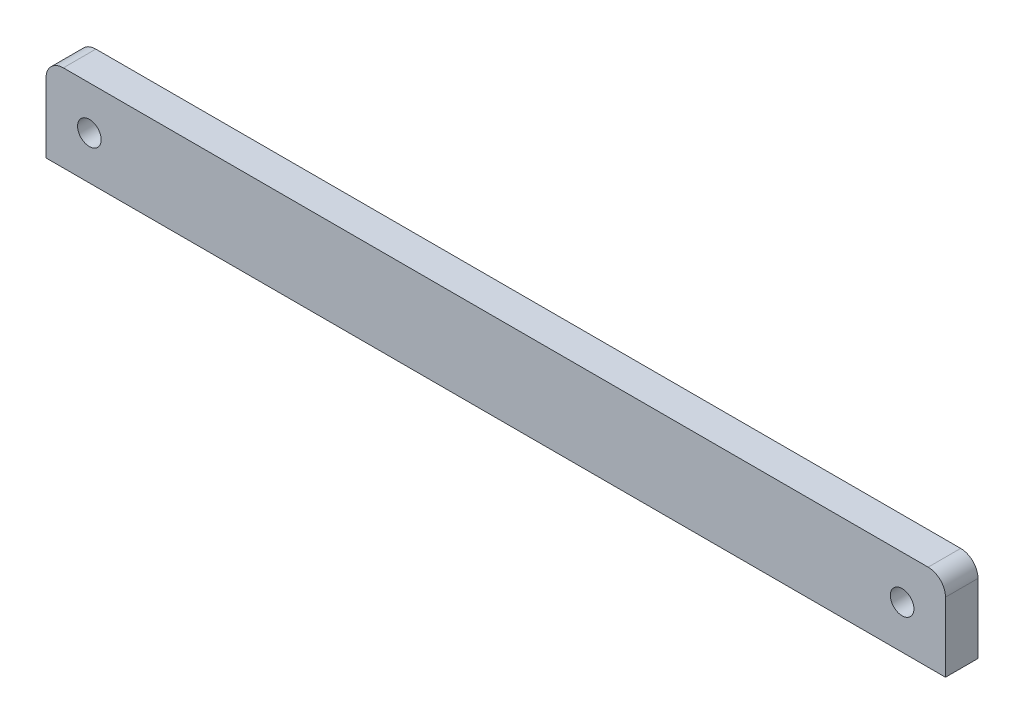
ISO-10303-21;
HEADER;
FILE_DESCRIPTION(('STEP AP214'),'2;1');
FILE_NAME('part.step','',(''),(''),'','','');
FILE_SCHEMA(('AUTOMOTIVE_DESIGN { 1 0 10303 214 1 1 1 1 }'));
ENDSEC;
DATA;
#1=APPLICATION_CONTEXT('core data for automotive mechanical design processes');
#2=APPLICATION_PROTOCOL_DEFINITION('international standard','automotive_design',2000,#1);
#3=PRODUCT_CONTEXT('',#1,'mechanical');
#4=PRODUCT('Part','Part','',(#3));
#5=PRODUCT_RELATED_PRODUCT_CATEGORY('part','',(#4));
#6=PRODUCT_DEFINITION_FORMATION('','',#4);
#7=PRODUCT_DEFINITION_CONTEXT('part definition',#1,'design');
#8=PRODUCT_DEFINITION('design','',#6,#7);
#9=PRODUCT_DEFINITION_SHAPE('','',#8);
#10=(LENGTH_UNIT() NAMED_UNIT(*) SI_UNIT(.MILLI.,.METRE.));
#11=(NAMED_UNIT(*) PLANE_ANGLE_UNIT() SI_UNIT($,.RADIAN.));
#12=(NAMED_UNIT(*) SI_UNIT($,.STERADIAN.) SOLID_ANGLE_UNIT());
#13=UNCERTAINTY_MEASURE_WITH_UNIT(LENGTH_MEASURE(1.E-05),#10,'distance_accuracy_value','');
#14=(GEOMETRIC_REPRESENTATION_CONTEXT(3) GLOBAL_UNCERTAINTY_ASSIGNED_CONTEXT((#13)) GLOBAL_UNIT_ASSIGNED_CONTEXT((#10,
#11,#12)) REPRESENTATION_CONTEXT('',''));
#15=CARTESIAN_POINT('',(0.,0.,0.));
#16=DIRECTION('',(0.,0.,1.));
#17=DIRECTION('',(1.,0.,0.));
#18=AXIS2_PLACEMENT_3D('',#15,#16,#17);
#19=CARTESIAN_POINT('',(0.,0.,4.7625));
#20=DIRECTION('',(0.,0.,1.));
#21=DIRECTION('',(1.,0.,0.));
#22=AXIS2_PLACEMENT_3D('',#19,#20,#21);
#23=PLANE('',#22);
#24=CARTESIAN_POINT('',(-20.6438550262832,45.8956103448276,4.7625));
#25=DIRECTION('',(0.,0.,1.));
#26=DIRECTION('',(1.,0.,0.));
#27=AXIS2_PLACEMENT_3D('',#24,#25,#26);
#28=CIRCLE('',#27,1.7272);
#29=CARTESIAN_POINT('',(-22.3710550262832,45.8956103448276,4.7625));
#30=VERTEX_POINT('',#29);
#31=EDGE_CURVE('E145',#30,#30,#28,.T.);
#32=ORIENTED_EDGE('',*,*,#31,.F.);
#33=EDGE_LOOP('',(#32));
#34=FACE_BOUND('',#33,.T.);
#35=DIRECTION('',(0.,1.,0.));
#36=VECTOR('',#35,1.);
#37=CARTESIAN_POINT('',(104.755944973717,52.2456103448276,4.7625));
#38=LINE('',#37,#36);
#39=CARTESIAN_POINT('',(104.755944973717,39.5456103448276,4.7625));
#40=VERTEX_POINT('',#39);
#41=CARTESIAN_POINT('',(104.755944973717,49.7056103448276,4.7625));
#42=VERTEX_POINT('',#41);
#43=EDGE_CURVE('E103',#40,#42,#38,.T.);
#44=ORIENTED_EDGE('',*,*,#43,.T.);
#45=CARTESIAN_POINT('',(102.215944973717,49.7056103448276,4.7625));
#46=DIRECTION('',(0.,0.,1.));
#47=DIRECTION('',(1.,0.,0.));
#48=AXIS2_PLACEMENT_3D('',#45,#46,#47);
#49=CIRCLE('',#48,2.54);
#50=CARTESIAN_POINT('',(102.215944973717,52.2456103448276,4.7625));
#51=VERTEX_POINT('',#50);
#52=EDGE_CURVE('E42',#42,#51,#49,.T.);
#53=ORIENTED_EDGE('',*,*,#52,.T.);
#54=DIRECTION('',(-1.,0.,0.));
#55=VECTOR('',#54,1.);
#56=CARTESIAN_POINT('',(-26.9938550262832,52.2456103448276,4.7625));
#57=LINE('',#56,#55);
#58=CARTESIAN_POINT('',(-24.4538550262832,52.2456103448276,4.7625));
#59=VERTEX_POINT('',#58);
#60=EDGE_CURVE('E113',#51,#59,#57,.T.);
#61=ORIENTED_EDGE('',*,*,#60,.T.);
#62=CARTESIAN_POINT('',(-24.4538550262832,49.7056103448276,4.7625));
#63=DIRECTION('',(0.,0.,1.));
#64=DIRECTION('',(1.,0.,0.));
#65=AXIS2_PLACEMENT_3D('',#62,#63,#64);
#66=CIRCLE('',#65,2.54);
#67=CARTESIAN_POINT('',(-26.9938550262832,49.7056103448276,4.7625));
#68=VERTEX_POINT('',#67);
#69=EDGE_CURVE('E49',#59,#68,#66,.T.);
#70=ORIENTED_EDGE('',*,*,#69,.T.);
#71=DIRECTION('',(0.,-1.,0.));
#72=VECTOR('',#71,1.);
#73=CARTESIAN_POINT('',(-26.9938550262832,52.2456103448276,4.7625));
#74=LINE('',#73,#72);
#75=CARTESIAN_POINT('',(-26.9938550262832,39.5456103448276,4.7625));
#76=VERTEX_POINT('',#75);
#77=EDGE_CURVE('E87',#68,#76,#74,.T.);
#78=ORIENTED_EDGE('',*,*,#77,.T.);
#79=DIRECTION('',(1.,0.,0.));
#80=VECTOR('',#79,1.);
#81=CARTESIAN_POINT('',(-26.9938550262832,39.5456103448276,4.7625));
#82=LINE('',#81,#80);
#83=EDGE_CURVE('E90',#76,#40,#82,.T.);
#84=ORIENTED_EDGE('',*,*,#83,.T.);
#85=EDGE_LOOP('',(#44,#53,#61,#70,#78,#84));
#86=FACE_BOUND('',#85,.T.);
#87=CARTESIAN_POINT('',(98.4059449737168,45.8956103448276,4.7625));
#88=DIRECTION('',(0.,0.,1.));
#89=DIRECTION('',(1.,0.,0.));
#90=AXIS2_PLACEMENT_3D('',#87,#88,#89);
#91=CIRCLE('',#90,1.7272);
#92=CARTESIAN_POINT('',(96.6787449737168,45.8956103448276,4.7625));
#93=VERTEX_POINT('',#92);
#94=EDGE_CURVE('E151',#93,#93,#91,.T.);
#95=ORIENTED_EDGE('',*,*,#94,.F.);
#96=EDGE_LOOP('',(#95));
#97=FACE_BOUND('',#96,.T.);
#98=ADVANCED_FACE('F34',(#34,#86,#97),#23,.T.);
#99=CARTESIAN_POINT('',(0.,0.,0.));
#100=DIRECTION('',(0.,0.,1.));
#101=DIRECTION('',(1.,0.,0.));
#102=AXIS2_PLACEMENT_3D('',#99,#100,#101);
#103=PLANE('',#102);
#104=DIRECTION('',(-1.,0.,0.));
#105=VECTOR('',#104,1.);
#106=CARTESIAN_POINT('',(-26.9938550262832,52.2456103448276,0.));
#107=LINE('',#106,#105);
#108=CARTESIAN_POINT('',(102.215944973717,52.2456103448276,0.));
#109=VERTEX_POINT('',#108);
#110=CARTESIAN_POINT('',(-24.4538550262832,52.2456103448276,0.));
#111=VERTEX_POINT('',#110);
#112=EDGE_CURVE('E95',#109,#111,#107,.T.);
#113=ORIENTED_EDGE('',*,*,#112,.F.);
#114=CARTESIAN_POINT('',(102.215944973717,49.7056103448276,0.));
#115=DIRECTION('',(0.,0.,1.));
#116=DIRECTION('',(1.,0.,0.));
#117=AXIS2_PLACEMENT_3D('',#114,#115,#116);
#118=CIRCLE('',#117,2.54);
#119=CARTESIAN_POINT('',(104.755944973717,49.7056103448276,0.));
#120=VERTEX_POINT('',#119);
#121=EDGE_CURVE('E121',#109,#120,#118,.F.);
#122=ORIENTED_EDGE('',*,*,#121,.T.);
#123=DIRECTION('',(0.,1.,0.));
#124=VECTOR('',#123,1.);
#125=CARTESIAN_POINT('',(104.755944973717,52.2456103448276,0.));
#126=LINE('',#125,#124);
#127=CARTESIAN_POINT('',(104.755944973717,39.5456103448276,0.));
#128=VERTEX_POINT('',#127);
#129=EDGE_CURVE('E139',#128,#120,#126,.T.);
#130=ORIENTED_EDGE('',*,*,#129,.F.);
#131=DIRECTION('',(1.,0.,0.));
#132=VECTOR('',#131,1.);
#133=CARTESIAN_POINT('',(-26.9938550262832,39.5456103448276,0.));
#134=LINE('',#133,#132);
#135=CARTESIAN_POINT('',(-26.9938550262832,39.5456103448276,0.));
#136=VERTEX_POINT('',#135);
#137=EDGE_CURVE('E141',#136,#128,#134,.T.);
#138=ORIENTED_EDGE('',*,*,#137,.F.);
#139=DIRECTION('',(0.,-1.,0.));
#140=VECTOR('',#139,1.);
#141=CARTESIAN_POINT('',(-26.9938550262832,52.2456103448276,0.));
#142=LINE('',#141,#140);
#143=CARTESIAN_POINT('',(-26.9938550262832,49.7056103448276,0.));
#144=VERTEX_POINT('',#143);
#145=EDGE_CURVE('E107',#144,#136,#142,.T.);
#146=ORIENTED_EDGE('',*,*,#145,.F.);
#147=CARTESIAN_POINT('',(-24.4538550262832,49.7056103448276,0.));
#148=DIRECTION('',(0.,0.,1.));
#149=DIRECTION('',(1.,0.,0.));
#150=AXIS2_PLACEMENT_3D('',#147,#148,#149);
#151=CIRCLE('',#150,2.54);
#152=EDGE_CURVE('E119',#144,#111,#151,.F.);
#153=ORIENTED_EDGE('',*,*,#152,.T.);
#154=EDGE_LOOP('',(#113,#122,#130,#138,#146,#153));
#155=FACE_BOUND('',#154,.T.);
#156=CARTESIAN_POINT('',(-20.6438550262832,45.8956103448276,0.));
#157=DIRECTION('',(0.,0.,1.));
#158=DIRECTION('',(1.,0.,0.));
#159=AXIS2_PLACEMENT_3D('',#156,#157,#158);
#160=CIRCLE('',#159,1.7272);
#161=CARTESIAN_POINT('',(-22.3710550262832,45.8956103448276,0.));
#162=VERTEX_POINT('',#161);
#163=EDGE_CURVE('E148',#162,#162,#160,.T.);
#164=ORIENTED_EDGE('',*,*,#163,.T.);
#165=EDGE_LOOP('',(#164));
#166=FACE_BOUND('',#165,.T.);
#167=CARTESIAN_POINT('',(98.4059449737168,45.8956103448276,0.));
#168=DIRECTION('',(0.,0.,1.));
#169=DIRECTION('',(1.,0.,0.));
#170=AXIS2_PLACEMENT_3D('',#167,#168,#169);
#171=CIRCLE('',#170,1.7272);
#172=CARTESIAN_POINT('',(96.6787449737168,45.8956103448276,0.));
#173=VERTEX_POINT('',#172);
#174=EDGE_CURVE('E154',#173,#173,#171,.T.);
#175=ORIENTED_EDGE('',*,*,#174,.T.);
#176=EDGE_LOOP('',(#175));
#177=FACE_BOUND('',#176,.T.);
#178=ADVANCED_FACE('F137',(#155,#166,#177),#103,.F.);
#179=CARTESIAN_POINT('',(-26.9938550262832,52.2456103448276,4.7625));
#180=DIRECTION('',(1.,0.,0.));
#181=DIRECTION('',(0.,1.,0.));
#182=AXIS2_PLACEMENT_3D('',#179,#180,#181);
#183=PLANE('',#182);
#184=ORIENTED_EDGE('',*,*,#77,.F.);
#185=DIRECTION('',(0.,0.,-1.));
#186=VECTOR('',#185,1.);
#187=CARTESIAN_POINT('',(-26.9938550262832,49.7056103448276,4.7625));
#188=LINE('',#187,#186);
#189=EDGE_CURVE('E11',#68,#144,#188,.T.);
#190=ORIENTED_EDGE('',*,*,#189,.T.);
#191=ORIENTED_EDGE('',*,*,#145,.T.);
#192=DIRECTION('',(0.,0.,-1.));
#193=VECTOR('',#192,1.);
#194=CARTESIAN_POINT('',(-26.9938550262832,39.5456103448276,4.7625));
#195=LINE('',#194,#193);
#196=EDGE_CURVE('E100',#76,#136,#195,.T.);
#197=ORIENTED_EDGE('',*,*,#196,.F.);
#198=EDGE_LOOP('',(#184,#190,#191,#197));
#199=FACE_BOUND('',#198,.T.);
#200=ADVANCED_FACE('F105',(#199),#183,.F.);
#201=CARTESIAN_POINT('',(-26.9938550262832,39.5456103448276,4.7625));
#202=DIRECTION('',(0.,1.,0.));
#203=DIRECTION('',(0.,0.,1.));
#204=AXIS2_PLACEMENT_3D('',#201,#202,#203);
#205=PLANE('',#204);
#206=ORIENTED_EDGE('',*,*,#137,.T.);
#207=DIRECTION('',(0.,0.,-1.));
#208=VECTOR('',#207,1.);
#209=CARTESIAN_POINT('',(104.755944973717,39.5456103448276,4.7625));
#210=LINE('',#209,#208);
#211=EDGE_CURVE('E102',#40,#128,#210,.T.);
#212=ORIENTED_EDGE('',*,*,#211,.F.);
#213=ORIENTED_EDGE('',*,*,#83,.F.);
#214=ORIENTED_EDGE('',*,*,#196,.T.);
#215=EDGE_LOOP('',(#206,#212,#213,#214));
#216=FACE_BOUND('',#215,.T.);
#217=ADVANCED_FACE('F99',(#216),#205,.F.);
#218=CARTESIAN_POINT('',(104.755944973717,52.2456103448276,4.7625));
#219=DIRECTION('',(-1.,0.,0.));
#220=DIRECTION('',(0.,0.,1.));
#221=AXIS2_PLACEMENT_3D('',#218,#219,#220);
#222=PLANE('',#221);
#223=ORIENTED_EDGE('',*,*,#129,.T.);
#224=DIRECTION('',(0.,0.,-1.));
#225=VECTOR('',#224,1.);
#226=CARTESIAN_POINT('',(104.755944973717,49.7056103448276,4.7625));
#227=LINE('',#226,#225);
#228=EDGE_CURVE('E57',#120,#42,#227,.F.);
#229=ORIENTED_EDGE('',*,*,#228,.T.);
#230=ORIENTED_EDGE('',*,*,#43,.F.);
#231=ORIENTED_EDGE('',*,*,#211,.T.);
#232=EDGE_LOOP('',(#223,#229,#230,#231));
#233=FACE_BOUND('',#232,.T.);
#234=ADVANCED_FACE('F140',(#233),#222,.F.);
#235=CARTESIAN_POINT('',(-26.9938550262832,52.2456103448276,4.7625));
#236=DIRECTION('',(0.,-1.,0.));
#237=DIRECTION('',(0.,0.,-1.));
#238=AXIS2_PLACEMENT_3D('',#235,#236,#237);
#239=PLANE('',#238);
#240=ORIENTED_EDGE('',*,*,#60,.F.);
#241=DIRECTION('',(0.,0.,-1.));
#242=VECTOR('',#241,1.);
#243=CARTESIAN_POINT('',(102.215944973717,52.2456103448276,4.7625));
#244=LINE('',#243,#242);
#245=EDGE_CURVE('E111',#51,#109,#244,.T.);
#246=ORIENTED_EDGE('',*,*,#245,.T.);
#247=ORIENTED_EDGE('',*,*,#112,.T.);
#248=DIRECTION('',(0.,0.,-1.));
#249=VECTOR('',#248,1.);
#250=CARTESIAN_POINT('',(-24.4538550262832,52.2456103448276,4.7625));
#251=LINE('',#250,#249);
#252=EDGE_CURVE('E109',#111,#59,#251,.F.);
#253=ORIENTED_EDGE('',*,*,#252,.T.);
#254=EDGE_LOOP('',(#240,#246,#247,#253));
#255=FACE_BOUND('',#254,.T.);
#256=ADVANCED_FACE('F129',(#255),#239,.F.);
#257=CARTESIAN_POINT('',(-20.6438550262832,45.8956103448276,4.7625));
#258=DIRECTION('',(0.,0.,-1.));
#259=DIRECTION('',(-1.,0.,0.));
#260=AXIS2_PLACEMENT_3D('',#257,#258,#259);
#261=CYLINDRICAL_SURFACE('',#260,1.7272);
#262=CARTESIAN_POINT('',(-22.3710550262832,45.8956103448276,4.7625));
#263=CARTESIAN_POINT('',(-22.3710550262832,45.8956103448276,4.712890625));
#264=CARTESIAN_POINT('',(-22.3710550262832,45.8956103448276,4.66328125));
#265=CARTESIAN_POINT('',(-22.3710550262832,45.8956103448276,4.5640625));
#266=CARTESIAN_POINT('',(-22.3710550262832,45.8956103448276,4.514453125));
#267=CARTESIAN_POINT('',(-22.3710550262832,45.8956103448276,4.415234375));
#268=CARTESIAN_POINT('',(-22.3710550262832,45.8956103448276,4.365625));
#269=CARTESIAN_POINT('',(-22.3710550262832,45.8956103448276,4.26640625));
#270=CARTESIAN_POINT('',(-22.3710550262832,45.8956103448276,4.216796875));
#271=CARTESIAN_POINT('',(-22.3710550262832,45.8956103448276,4.117578125));
#272=CARTESIAN_POINT('',(-22.3710550262832,45.8956103448276,4.06796875));
#273=CARTESIAN_POINT('',(-22.3710550262832,45.8956103448276,3.96875));
#274=CARTESIAN_POINT('',(-22.3710550262832,45.8956103448276,3.919140625));
#275=CARTESIAN_POINT('',(-22.3710550262832,45.8956103448276,3.819921875));
#276=CARTESIAN_POINT('',(-22.3710550262832,45.8956103448276,3.7703125));
#277=CARTESIAN_POINT('',(-22.3710550262832,45.8956103448276,3.67109375));
#278=CARTESIAN_POINT('',(-22.3710550262832,45.8956103448276,3.621484375));
#279=CARTESIAN_POINT('',(-22.3710550262832,45.8956103448276,3.522265625));
#280=CARTESIAN_POINT('',(-22.3710550262832,45.8956103448276,3.47265625));
#281=CARTESIAN_POINT('',(-22.3710550262832,45.8956103448276,3.3734375));
#282=CARTESIAN_POINT('',(-22.3710550262832,45.8956103448276,3.323828125));
#283=CARTESIAN_POINT('',(-22.3710550262832,45.8956103448276,3.224609375));
#284=CARTESIAN_POINT('',(-22.3710550262832,45.8956103448276,3.175));
#285=CARTESIAN_POINT('',(-22.3710550262832,45.8956103448276,3.07578125));
#286=CARTESIAN_POINT('',(-22.3710550262832,45.8956103448276,3.026171875));
#287=CARTESIAN_POINT('',(-22.3710550262832,45.8956103448276,2.926953125));
#288=CARTESIAN_POINT('',(-22.3710550262832,45.8956103448276,2.87734375));
#289=CARTESIAN_POINT('',(-22.3710550262832,45.8956103448276,2.778125));
#290=CARTESIAN_POINT('',(-22.3710550262832,45.8956103448276,2.728515625));
#291=CARTESIAN_POINT('',(-22.3710550262832,45.8956103448276,2.629296875));
#292=CARTESIAN_POINT('',(-22.3710550262832,45.8956103448276,2.5796875));
#293=CARTESIAN_POINT('',(-22.3710550262832,45.8956103448276,2.48046875));
#294=CARTESIAN_POINT('',(-22.3710550262832,45.8956103448276,2.430859375));
#295=CARTESIAN_POINT('',(-22.3710550262832,45.8956103448276,2.331640625));
#296=CARTESIAN_POINT('',(-22.3710550262832,45.8956103448276,2.28203125));
#297=CARTESIAN_POINT('',(-22.3710550262832,45.8956103448276,2.1828125));
#298=CARTESIAN_POINT('',(-22.3710550262832,45.8956103448276,2.133203125));
#299=CARTESIAN_POINT('',(-22.3710550262832,45.8956103448276,2.033984375));
#300=CARTESIAN_POINT('',(-22.3710550262832,45.8956103448276,1.984375));
#301=CARTESIAN_POINT('',(-22.3710550262832,45.8956103448276,1.88515625));
#302=CARTESIAN_POINT('',(-22.3710550262832,45.8956103448276,1.835546875));
#303=CARTESIAN_POINT('',(-22.3710550262832,45.8956103448276,1.736328125));
#304=CARTESIAN_POINT('',(-22.3710550262832,45.8956103448276,1.68671875));
#305=CARTESIAN_POINT('',(-22.3710550262832,45.8956103448276,1.5875));
#306=CARTESIAN_POINT('',(-22.3710550262832,45.8956103448276,1.537890625));
#307=CARTESIAN_POINT('',(-22.3710550262832,45.8956103448276,1.438671875));
#308=CARTESIAN_POINT('',(-22.3710550262832,45.8956103448276,1.3890625));
#309=CARTESIAN_POINT('',(-22.3710550262832,45.8956103448276,1.28984375));
#310=CARTESIAN_POINT('',(-22.3710550262832,45.8956103448276,1.240234375));
#311=CARTESIAN_POINT('',(-22.3710550262832,45.8956103448276,1.141015625));
#312=CARTESIAN_POINT('',(-22.3710550262832,45.8956103448276,1.09140625));
#313=CARTESIAN_POINT('',(-22.3710550262832,45.8956103448276,0.992187499999999));
#314=CARTESIAN_POINT('',(-22.3710550262832,45.8956103448276,0.942578124999999));
#315=CARTESIAN_POINT('',(-22.3710550262832,45.8956103448276,0.843359375));
#316=CARTESIAN_POINT('',(-22.3710550262832,45.8956103448276,0.79375));
#317=CARTESIAN_POINT('',(-22.3710550262832,45.8956103448276,0.69453125));
#318=CARTESIAN_POINT('',(-22.3710550262832,45.8956103448276,0.644921875));
#319=CARTESIAN_POINT('',(-22.3710550262832,45.8956103448276,0.545703125));
#320=CARTESIAN_POINT('',(-22.3710550262832,45.8956103448276,0.49609375));
#321=CARTESIAN_POINT('',(-22.3710550262832,45.8956103448276,0.396875));
#322=CARTESIAN_POINT('',(-22.3710550262832,45.8956103448276,0.347265625));
#323=CARTESIAN_POINT('',(-22.3710550262832,45.8956103448276,0.248046875));
#324=CARTESIAN_POINT('',(-22.3710550262832,45.8956103448276,0.1984375));
#325=CARTESIAN_POINT('',(-22.3710550262832,45.8956103448276,0.09921875));
#326=CARTESIAN_POINT('',(-22.3710550262832,45.8956103448276,0.049609375));
#327=CARTESIAN_POINT('',(-22.3710550262832,45.8956103448276,0.));
#328=B_SPLINE_CURVE_WITH_KNOTS('',3,(#262,#263,#264,#265,#266,#267,#268,#269,#270,#271,#272,
#273,#274,#275,#276,#277,#278,#279,#280,#281,#282,#283,#284,#285,#286,#287,#288,#289,#290,#291,
#292,#293,#294,#295,#296,#297,#298,#299,#300,#301,#302,#303,#304,#305,#306,#307,#308,#309,#310,
#311,#312,#313,#314,#315,#316,#317,#318,#319,#320,#321,#322,#323,#324,#325,#326,#327),
.UNSPECIFIED.,.F.,.F.,(4,2,2,2,2,2,2,2,2,2,2,2,2,2,2,2,2,2,2,2,2,2,2,2,2,2,2,2,2,2,2,2,4),(0.,
0.148828125,0.29765625,0.446484375,0.5953125,0.744140625,0.892968750000001,1.041796875,1.190625,
1.339453125,1.48828125,1.637109375,1.7859375,1.934765625,2.08359375,2.232421875,2.38125,
2.530078125,2.67890625,2.827734375,2.9765625,3.125390625,3.27421875,3.423046875,3.571875,
3.720703125,3.86953125,4.018359375,4.1671875,4.316015625,4.46484375,4.613671875,4.7625),.UNSPECIFIED.);
#329=EDGE_CURVE('BSEAM171',#30,#162,#328,.T.);
#330=ORIENTED_EDGE('',*,*,#31,.T.);
#331=ORIENTED_EDGE('',*,*,#163,.F.);
#332=ORIENTED_EDGE('',*,*,#329,.T.);
#333=ORIENTED_EDGE('',*,*,#329,.F.);
#334=EDGE_LOOP('',(#330,#332,#331,#333));
#335=FACE_BOUND('',#334,.T.);
#336=ADVANCED_FACE('F171',(#335),#261,.F.);
#337=CARTESIAN_POINT('',(98.4059449737168,45.8956103448276,4.7625));
#338=DIRECTION('',(0.,0.,-1.));
#339=DIRECTION('',(-1.,0.,0.));
#340=AXIS2_PLACEMENT_3D('',#337,#338,#339);
#341=CYLINDRICAL_SURFACE('',#340,1.7272);
#342=CARTESIAN_POINT('',(96.6787449737168,45.8956103448276,4.7625));
#343=CARTESIAN_POINT('',(96.6787449737168,45.8956103448276,4.712890625));
#344=CARTESIAN_POINT('',(96.6787449737168,45.8956103448276,4.66328125));
#345=CARTESIAN_POINT('',(96.6787449737168,45.8956103448276,4.5640625));
#346=CARTESIAN_POINT('',(96.6787449737168,45.8956103448276,4.514453125));
#347=CARTESIAN_POINT('',(96.6787449737168,45.8956103448276,4.415234375));
#348=CARTESIAN_POINT('',(96.6787449737168,45.8956103448276,4.365625));
#349=CARTESIAN_POINT('',(96.6787449737168,45.8956103448276,4.26640625));
#350=CARTESIAN_POINT('',(96.6787449737168,45.8956103448276,4.216796875));
#351=CARTESIAN_POINT('',(96.6787449737168,45.8956103448276,4.117578125));
#352=CARTESIAN_POINT('',(96.6787449737168,45.8956103448276,4.06796875));
#353=CARTESIAN_POINT('',(96.6787449737168,45.8956103448276,3.96875));
#354=CARTESIAN_POINT('',(96.6787449737168,45.8956103448276,3.919140625));
#355=CARTESIAN_POINT('',(96.6787449737168,45.8956103448276,3.819921875));
#356=CARTESIAN_POINT('',(96.6787449737168,45.8956103448276,3.7703125));
#357=CARTESIAN_POINT('',(96.6787449737168,45.8956103448276,3.67109375));
#358=CARTESIAN_POINT('',(96.6787449737168,45.8956103448276,3.621484375));
#359=CARTESIAN_POINT('',(96.6787449737168,45.8956103448276,3.522265625));
#360=CARTESIAN_POINT('',(96.6787449737168,45.8956103448276,3.47265625));
#361=CARTESIAN_POINT('',(96.6787449737168,45.8956103448276,3.3734375));
#362=CARTESIAN_POINT('',(96.6787449737168,45.8956103448276,3.323828125));
#363=CARTESIAN_POINT('',(96.6787449737168,45.8956103448276,3.224609375));
#364=CARTESIAN_POINT('',(96.6787449737168,45.8956103448276,3.175));
#365=CARTESIAN_POINT('',(96.6787449737168,45.8956103448276,3.07578125));
#366=CARTESIAN_POINT('',(96.6787449737168,45.8956103448276,3.026171875));
#367=CARTESIAN_POINT('',(96.6787449737168,45.8956103448276,2.926953125));
#368=CARTESIAN_POINT('',(96.6787449737168,45.8956103448276,2.87734375));
#369=CARTESIAN_POINT('',(96.6787449737168,45.8956103448276,2.778125));
#370=CARTESIAN_POINT('',(96.6787449737168,45.8956103448276,2.728515625));
#371=CARTESIAN_POINT('',(96.6787449737168,45.8956103448276,2.629296875));
#372=CARTESIAN_POINT('',(96.6787449737168,45.8956103448276,2.5796875));
#373=CARTESIAN_POINT('',(96.6787449737168,45.8956103448276,2.48046875));
#374=CARTESIAN_POINT('',(96.6787449737168,45.8956103448276,2.430859375));
#375=CARTESIAN_POINT('',(96.6787449737168,45.8956103448276,2.331640625));
#376=CARTESIAN_POINT('',(96.6787449737168,45.8956103448276,2.28203125));
#377=CARTESIAN_POINT('',(96.6787449737168,45.8956103448276,2.1828125));
#378=CARTESIAN_POINT('',(96.6787449737168,45.8956103448276,2.133203125));
#379=CARTESIAN_POINT('',(96.6787449737168,45.8956103448276,2.033984375));
#380=CARTESIAN_POINT('',(96.6787449737168,45.8956103448276,1.984375));
#381=CARTESIAN_POINT('',(96.6787449737168,45.8956103448276,1.88515625));
#382=CARTESIAN_POINT('',(96.6787449737168,45.8956103448276,1.835546875));
#383=CARTESIAN_POINT('',(96.6787449737168,45.8956103448276,1.736328125));
#384=CARTESIAN_POINT('',(96.6787449737168,45.8956103448276,1.68671875));
#385=CARTESIAN_POINT('',(96.6787449737168,45.8956103448276,1.5875));
#386=CARTESIAN_POINT('',(96.6787449737168,45.8956103448276,1.537890625));
#387=CARTESIAN_POINT('',(96.6787449737168,45.8956103448276,1.438671875));
#388=CARTESIAN_POINT('',(96.6787449737168,45.8956103448276,1.3890625));
#389=CARTESIAN_POINT('',(96.6787449737168,45.8956103448276,1.28984375));
#390=CARTESIAN_POINT('',(96.6787449737168,45.8956103448276,1.240234375));
#391=CARTESIAN_POINT('',(96.6787449737168,45.8956103448276,1.141015625));
#392=CARTESIAN_POINT('',(96.6787449737168,45.8956103448276,1.09140625));
#393=CARTESIAN_POINT('',(96.6787449737168,45.8956103448276,0.992187499999999));
#394=CARTESIAN_POINT('',(96.6787449737168,45.8956103448276,0.942578124999999));
#395=CARTESIAN_POINT('',(96.6787449737168,45.8956103448276,0.843359375));
#396=CARTESIAN_POINT('',(96.6787449737168,45.8956103448276,0.79375));
#397=CARTESIAN_POINT('',(96.6787449737168,45.8956103448276,0.69453125));
#398=CARTESIAN_POINT('',(96.6787449737168,45.8956103448276,0.644921875));
#399=CARTESIAN_POINT('',(96.6787449737168,45.8956103448276,0.545703125));
#400=CARTESIAN_POINT('',(96.6787449737168,45.8956103448276,0.49609375));
#401=CARTESIAN_POINT('',(96.6787449737168,45.8956103448276,0.396875));
#402=CARTESIAN_POINT('',(96.6787449737168,45.8956103448276,0.347265625));
#403=CARTESIAN_POINT('',(96.6787449737168,45.8956103448276,0.248046875));
#404=CARTESIAN_POINT('',(96.6787449737168,45.8956103448276,0.1984375));
#405=CARTESIAN_POINT('',(96.6787449737168,45.8956103448276,0.09921875));
#406=CARTESIAN_POINT('',(96.6787449737168,45.8956103448276,0.049609375));
#407=CARTESIAN_POINT('',(96.6787449737168,45.8956103448276,0.));
#408=B_SPLINE_CURVE_WITH_KNOTS('',3,(#342,#343,#344,#345,#346,#347,#348,#349,#350,#351,#352,
#353,#354,#355,#356,#357,#358,#359,#360,#361,#362,#363,#364,#365,#366,#367,#368,#369,#370,#371,
#372,#373,#374,#375,#376,#377,#378,#379,#380,#381,#382,#383,#384,#385,#386,#387,#388,#389,#390,
#391,#392,#393,#394,#395,#396,#397,#398,#399,#400,#401,#402,#403,#404,#405,#406,#407),
.UNSPECIFIED.,.F.,.F.,(4,2,2,2,2,2,2,2,2,2,2,2,2,2,2,2,2,2,2,2,2,2,2,2,2,2,2,2,2,2,2,2,4),(0.,
0.148828125,0.29765625,0.446484375,0.5953125,0.744140625,0.892968750000001,1.041796875,1.190625,
1.339453125,1.48828125,1.637109375,1.7859375,1.934765625,2.08359375,2.232421875,2.38125,
2.530078125,2.67890625,2.827734375,2.9765625,3.125390625,3.27421875,3.423046875,3.571875,
3.720703125,3.86953125,4.018359375,4.1671875,4.316015625,4.46484375,4.613671875,4.7625),.UNSPECIFIED.);
#409=EDGE_CURVE('BSEAM160',#93,#173,#408,.T.);
#410=ORIENTED_EDGE('',*,*,#94,.T.);
#411=ORIENTED_EDGE('',*,*,#174,.F.);
#412=ORIENTED_EDGE('',*,*,#409,.T.);
#413=ORIENTED_EDGE('',*,*,#409,.F.);
#414=EDGE_LOOP('',(#410,#412,#411,#413));
#415=FACE_BOUND('',#414,.T.);
#416=ADVANCED_FACE('F160',(#415),#341,.F.);
#417=CARTESIAN_POINT('',(102.215944973717,49.7056103448276,4.7625));
#418=DIRECTION('',(0.,0.,-1.));
#419=DIRECTION('',(-1.,0.,0.));
#420=AXIS2_PLACEMENT_3D('',#417,#418,#419);
#421=CYLINDRICAL_SURFACE('',#420,2.54);
#422=ORIENTED_EDGE('',*,*,#52,.F.);
#423=ORIENTED_EDGE('',*,*,#228,.F.);
#424=ORIENTED_EDGE('',*,*,#121,.F.);
#425=ORIENTED_EDGE('',*,*,#245,.F.);
#426=EDGE_LOOP('',(#422,#423,#424,#425));
#427=FACE_BOUND('',#426,.T.);
#428=ADVANCED_FACE('F134',(#427),#421,.T.);
#429=CARTESIAN_POINT('',(-24.4538550262832,49.7056103448276,4.7625));
#430=DIRECTION('',(0.,0.,-1.));
#431=DIRECTION('',(-1.,0.,0.));
#432=AXIS2_PLACEMENT_3D('',#429,#430,#431);
#433=CYLINDRICAL_SURFACE('',#432,2.54);
#434=ORIENTED_EDGE('',*,*,#69,.F.);
#435=ORIENTED_EDGE('',*,*,#252,.F.);
#436=ORIENTED_EDGE('',*,*,#152,.F.);
#437=ORIENTED_EDGE('',*,*,#189,.F.);
#438=EDGE_LOOP('',(#434,#435,#436,#437));
#439=FACE_BOUND('',#438,.T.);
#440=ADVANCED_FACE('F36',(#439),#433,.T.);
#441=CLOSED_SHELL('',(#98,#178,#200,#217,#234,#256,#336,#416,#428,#440));
#442=MANIFOLD_SOLID_BREP('B2',#441);
#443=ADVANCED_BREP_SHAPE_REPRESENTATION('',(#18,#442),#14);
#444=SHAPE_DEFINITION_REPRESENTATION(#9,#443);
ENDSEC;
END-ISO-10303-21;
